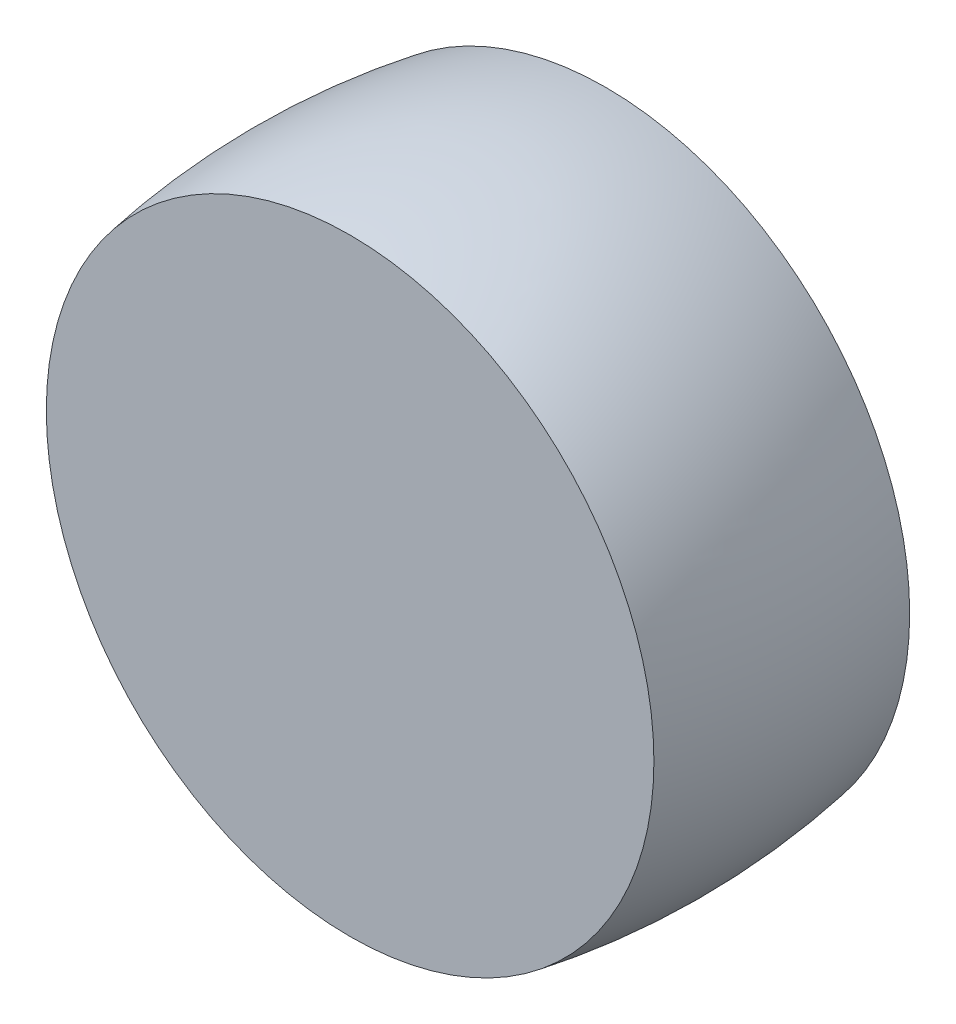
ISO-10303-21;
HEADER;
FILE_DESCRIPTION(('STEP AP214'),'2;1');
FILE_NAME('part.step','',(''),(''),'','','');
FILE_SCHEMA(('AUTOMOTIVE_DESIGN { 1 0 10303 214 1 1 1 1 }'));
ENDSEC;
DATA;
#1=APPLICATION_CONTEXT('core data for automotive mechanical design processes');
#2=APPLICATION_PROTOCOL_DEFINITION('international standard','automotive_design',2000,#1);
#3=PRODUCT_CONTEXT('',#1,'mechanical');
#4=PRODUCT('Part','Part','',(#3));
#5=PRODUCT_RELATED_PRODUCT_CATEGORY('part','',(#4));
#6=PRODUCT_DEFINITION_FORMATION('','',#4);
#7=PRODUCT_DEFINITION_CONTEXT('part definition',#1,'design');
#8=PRODUCT_DEFINITION('design','',#6,#7);
#9=PRODUCT_DEFINITION_SHAPE('','',#8);
#10=(LENGTH_UNIT() NAMED_UNIT(*) SI_UNIT(.MILLI.,.METRE.));
#11=(NAMED_UNIT(*) PLANE_ANGLE_UNIT() SI_UNIT($,.RADIAN.));
#12=(NAMED_UNIT(*) SI_UNIT($,.STERADIAN.) SOLID_ANGLE_UNIT());
#13=UNCERTAINTY_MEASURE_WITH_UNIT(LENGTH_MEASURE(1.E-05),#10,'distance_accuracy_value','');
#14=(GEOMETRIC_REPRESENTATION_CONTEXT(3) GLOBAL_UNCERTAINTY_ASSIGNED_CONTEXT((#13)) GLOBAL_UNIT_ASSIGNED_CONTEXT((#10,
#11,#12)) REPRESENTATION_CONTEXT('',''));
#15=CARTESIAN_POINT('',(0.,0.,0.));
#16=DIRECTION('',(0.,0.,1.));
#17=DIRECTION('',(1.,0.,0.));
#18=AXIS2_PLACEMENT_3D('',#15,#16,#17);
#19=CARTESIAN_POINT('',(0.,0.,0.));
#20=DIRECTION('',(0.,0.,1.));
#21=DIRECTION('',(1.,0.,0.));
#22=AXIS2_PLACEMENT_3D('',#19,#20,#21);
#23=PLANE('',#22);
#24=DIRECTION('',(-0.5,0.866025403784439,0.));
#25=VECTOR('',#24,1.);
#26=CARTESIAN_POINT('',(-3.46410161513775,-6.,0.));
#27=LINE('',#26,#25);
#28=CARTESIAN_POINT('',(-3.46410161513775,-6.,0.));
#29=VERTEX_POINT('',#28);
#30=CARTESIAN_POINT('',(-6.92820323027551,0.,0.));
#31=VERTEX_POINT('',#30);
#32=EDGE_CURVE('E135',#29,#31,#27,.T.);
#33=ORIENTED_EDGE('',*,*,#32,.F.);
#34=DIRECTION('',(-1.,0.,0.));
#35=VECTOR('',#34,1.);
#36=CARTESIAN_POINT('',(3.46410161513775,-6.,0.));
#37=LINE('',#36,#35);
#38=CARTESIAN_POINT('',(3.46410161513775,-6.,0.));
#39=VERTEX_POINT('',#38);
#40=EDGE_CURVE('E55',#39,#29,#37,.T.);
#41=ORIENTED_EDGE('',*,*,#40,.F.);
#42=DIRECTION('',(-0.5,-0.866025403784439,0.));
#43=VECTOR('',#42,1.);
#44=CARTESIAN_POINT('',(6.92820323027551,0.,0.));
#45=LINE('',#44,#43);
#46=CARTESIAN_POINT('',(6.92820323027551,0.,0.));
#47=VERTEX_POINT('',#46);
#48=EDGE_CURVE('E148',#47,#39,#45,.T.);
#49=ORIENTED_EDGE('',*,*,#48,.F.);
#50=DIRECTION('',(0.5,-0.866025403784439,0.));
#51=VECTOR('',#50,1.);
#52=CARTESIAN_POINT('',(3.46410161513776,6.,0.));
#53=LINE('',#52,#51);
#54=CARTESIAN_POINT('',(3.46410161513776,6.,0.));
#55=VERTEX_POINT('',#54);
#56=EDGE_CURVE('E145',#55,#47,#53,.T.);
#57=ORIENTED_EDGE('',*,*,#56,.F.);
#58=DIRECTION('',(1.,0.,0.));
#59=VECTOR('',#58,1.);
#60=CARTESIAN_POINT('',(-3.46410161513775,6.,0.));
#61=LINE('',#60,#59);
#62=CARTESIAN_POINT('',(-3.46410161513775,6.,0.));
#63=VERTEX_POINT('',#62);
#64=EDGE_CURVE('E103',#63,#55,#61,.T.);
#65=ORIENTED_EDGE('',*,*,#64,.F.);
#66=DIRECTION('',(0.5,0.866025403784438,0.));
#67=VECTOR('',#66,1.);
#68=CARTESIAN_POINT('',(-6.92820323027551,0.,0.));
#69=LINE('',#68,#67);
#70=EDGE_CURVE('E139',#31,#63,#69,.T.);
#71=ORIENTED_EDGE('',*,*,#70,.F.);
#72=EDGE_LOOP('',(#33,#41,#49,#57,#65,#71));
#73=FACE_BOUND('',#72,.T.);
#74=CARTESIAN_POINT('',(0.,0.,0.));
#75=DIRECTION('',(0.,0.,-1.));
#76=DIRECTION('',(-1.,0.,0.));
#77=AXIS2_PLACEMENT_3D('',#74,#75,#76);
#78=CIRCLE('',#77,30.882887531048);
#79=CARTESIAN_POINT('',(-30.882887531048,0.,0.));
#80=VERTEX_POINT('',#79);
#81=EDGE_CURVE('E48',#80,#80,#78,.T.);
#82=ORIENTED_EDGE('',*,*,#81,.T.);
#83=EDGE_LOOP('',(#82));
#84=FACE_BOUND('',#83,.T.);
#85=ADVANCED_FACE('F40',(#73,#84),#23,.F.);
#86=CARTESIAN_POINT('',(0.,0.,13.));
#87=DIRECTION('',(0.,0.,-1.));
#88=DIRECTION('',(-1.,0.,0.));
#89=AXIS2_PLACEMENT_3D('',#86,#87,#88);
#90=DEGENERATE_TOROIDAL_SURFACE('',#89,44.2,76.2,.F.);
#91=CARTESIAN_POINT('',(0.,0.,26.));
#92=DIRECTION('',(0.,0.,-1.));
#93=DIRECTION('',(-1.,0.,0.));
#94=AXIS2_PLACEMENT_3D('',#91,#92,#93);
#95=CIRCLE('',#94,30.882887531048);
#96=CARTESIAN_POINT('',(-30.882887531048,0.,26.));
#97=VERTEX_POINT('',#96);
#98=EDGE_CURVE('E11',#97,#97,#95,.T.);
#99=ORIENTED_EDGE('',*,*,#98,.T.);
#100=EDGE_LOOP('',(#99));
#101=FACE_BOUND('',#100,.T.);
#102=ORIENTED_EDGE('',*,*,#81,.F.);
#103=EDGE_LOOP('',(#102));
#104=FACE_BOUND('',#103,.T.);
#105=ADVANCED_FACE('F167',(#101,#104),#90,.F.);
#106=CARTESIAN_POINT('',(0.,0.,26.));
#107=DIRECTION('',(0.,0.,1.));
#108=DIRECTION('',(1.,0.,0.));
#109=AXIS2_PLACEMENT_3D('',#106,#107,#108);
#110=PLANE('',#109);
#111=ORIENTED_EDGE('',*,*,#98,.F.);
#112=EDGE_LOOP('',(#111));
#113=FACE_BOUND('',#112,.T.);
#114=ADVANCED_FACE('F169',(#113),#110,.T.);
#115=CARTESIAN_POINT('',(3.46410161513775,-6.,16.));
#116=DIRECTION('',(0.,-1.,0.));
#117=DIRECTION('',(1.,0.,0.));
#118=AXIS2_PLACEMENT_3D('',#115,#116,#117);
#119=PLANE('',#118);
#120=ORIENTED_EDGE('',*,*,#40,.T.);
#121=DIRECTION('',(0.,0.,-1.));
#122=VECTOR('',#121,1.);
#123=CARTESIAN_POINT('',(-3.46410161513775,-6.,16.));
#124=LINE('',#123,#122);
#125=CARTESIAN_POINT('',(-3.46410161513775,-6.,16.));
#126=VERTEX_POINT('',#125);
#127=EDGE_CURVE('E85',#126,#29,#124,.T.);
#128=ORIENTED_EDGE('',*,*,#127,.F.);
#129=DIRECTION('',(-1.,0.,0.));
#130=VECTOR('',#129,1.);
#131=CARTESIAN_POINT('',(3.46410161513775,-6.,16.));
#132=LINE('',#131,#130);
#133=CARTESIAN_POINT('',(3.46410161513775,-6.,16.));
#134=VERTEX_POINT('',#133);
#135=EDGE_CURVE('E151',#134,#126,#132,.T.);
#136=ORIENTED_EDGE('',*,*,#135,.F.);
#137=DIRECTION('',(0.,0.,-1.));
#138=VECTOR('',#137,1.);
#139=CARTESIAN_POINT('',(3.46410161513775,-6.,16.));
#140=LINE('',#139,#138);
#141=EDGE_CURVE('E63',#134,#39,#140,.T.);
#142=ORIENTED_EDGE('',*,*,#141,.T.);
#143=EDGE_LOOP('',(#120,#128,#136,#142));
#144=FACE_BOUND('',#143,.T.);
#145=ADVANCED_FACE('F176',(#144),#119,.F.);
#146=CARTESIAN_POINT('',(6.92820323027551,0.,16.));
#147=DIRECTION('',(0.866025403784439,-0.5,0.));
#148=DIRECTION('',(0.5,0.866025403784439,0.));
#149=AXIS2_PLACEMENT_3D('',#146,#147,#148);
#150=PLANE('',#149);
#151=ORIENTED_EDGE('',*,*,#48,.T.);
#152=ORIENTED_EDGE('',*,*,#141,.F.);
#153=DIRECTION('',(-0.5,-0.866025403784439,0.));
#154=VECTOR('',#153,1.);
#155=CARTESIAN_POINT('',(6.92820323027551,0.,16.));
#156=LINE('',#155,#154);
#157=CARTESIAN_POINT('',(6.92820323027551,0.,16.));
#158=VERTEX_POINT('',#157);
#159=EDGE_CURVE('E117',#158,#134,#156,.T.);
#160=ORIENTED_EDGE('',*,*,#159,.F.);
#161=DIRECTION('',(0.,0.,-1.));
#162=VECTOR('',#161,1.);
#163=CARTESIAN_POINT('',(6.92820323027551,0.,16.));
#164=LINE('',#163,#162);
#165=EDGE_CURVE('E108',#158,#47,#164,.T.);
#166=ORIENTED_EDGE('',*,*,#165,.T.);
#167=EDGE_LOOP('',(#151,#152,#160,#166));
#168=FACE_BOUND('',#167,.T.);
#169=ADVANCED_FACE('F183',(#168),#150,.F.);
#170=CARTESIAN_POINT('',(3.46410161513776,6.,16.));
#171=DIRECTION('',(0.866025403784439,0.5,0.));
#172=DIRECTION('',(-0.5,0.866025403784439,0.));
#173=AXIS2_PLACEMENT_3D('',#170,#171,#172);
#174=PLANE('',#173);
#175=ORIENTED_EDGE('',*,*,#56,.T.);
#176=ORIENTED_EDGE('',*,*,#165,.F.);
#177=DIRECTION('',(0.5,-0.866025403784439,0.));
#178=VECTOR('',#177,1.);
#179=CARTESIAN_POINT('',(3.46410161513776,6.,16.));
#180=LINE('',#179,#178);
#181=CARTESIAN_POINT('',(3.46410161513776,6.,16.));
#182=VERTEX_POINT('',#181);
#183=EDGE_CURVE('E112',#182,#158,#180,.T.);
#184=ORIENTED_EDGE('',*,*,#183,.F.);
#185=DIRECTION('',(0.,0.,-1.));
#186=VECTOR('',#185,1.);
#187=CARTESIAN_POINT('',(3.46410161513776,6.,16.));
#188=LINE('',#187,#186);
#189=EDGE_CURVE('E96',#182,#55,#188,.T.);
#190=ORIENTED_EDGE('',*,*,#189,.T.);
#191=EDGE_LOOP('',(#175,#176,#184,#190));
#192=FACE_BOUND('',#191,.T.);
#193=ADVANCED_FACE('F113',(#192),#174,.F.);
#194=CARTESIAN_POINT('',(-3.46410161513775,6.,16.));
#195=DIRECTION('',(0.,1.,0.));
#196=DIRECTION('',(0.,0.,1.));
#197=AXIS2_PLACEMENT_3D('',#194,#195,#196);
#198=PLANE('',#197);
#199=ORIENTED_EDGE('',*,*,#64,.T.);
#200=ORIENTED_EDGE('',*,*,#189,.F.);
#201=DIRECTION('',(1.,0.,0.));
#202=VECTOR('',#201,1.);
#203=CARTESIAN_POINT('',(-3.46410161513775,6.,16.));
#204=LINE('',#203,#202);
#205=CARTESIAN_POINT('',(-3.46410161513775,6.,16.));
#206=VERTEX_POINT('',#205);
#207=EDGE_CURVE('E100',#206,#182,#204,.T.);
#208=ORIENTED_EDGE('',*,*,#207,.F.);
#209=DIRECTION('',(0.,0.,-1.));
#210=VECTOR('',#209,1.);
#211=CARTESIAN_POINT('',(-3.46410161513775,6.,16.));
#212=LINE('',#211,#210);
#213=EDGE_CURVE('E109',#206,#63,#212,.T.);
#214=ORIENTED_EDGE('',*,*,#213,.T.);
#215=EDGE_LOOP('',(#199,#200,#208,#214));
#216=FACE_BOUND('',#215,.T.);
#217=ADVANCED_FACE('F98',(#216),#198,.F.);
#218=CARTESIAN_POINT('',(-6.92820323027551,0.,16.));
#219=DIRECTION('',(-0.866025403784439,0.5,0.));
#220=DIRECTION('',(-0.5,-0.866025403784438,0.));
#221=AXIS2_PLACEMENT_3D('',#218,#219,#220);
#222=PLANE('',#221);
#223=ORIENTED_EDGE('',*,*,#70,.T.);
#224=ORIENTED_EDGE('',*,*,#213,.F.);
#225=DIRECTION('',(0.5,0.866025403784438,0.));
#226=VECTOR('',#225,1.);
#227=CARTESIAN_POINT('',(-6.92820323027551,0.,16.));
#228=LINE('',#227,#226);
#229=CARTESIAN_POINT('',(-6.92820323027551,0.,16.));
#230=VERTEX_POINT('',#229);
#231=EDGE_CURVE('E123',#230,#206,#228,.T.);
#232=ORIENTED_EDGE('',*,*,#231,.F.);
#233=DIRECTION('',(0.,0.,-1.));
#234=VECTOR('',#233,1.);
#235=CARTESIAN_POINT('',(-6.92820323027551,0.,16.));
#236=LINE('',#235,#234);
#237=EDGE_CURVE('E158',#230,#31,#236,.T.);
#238=ORIENTED_EDGE('',*,*,#237,.T.);
#239=EDGE_LOOP('',(#223,#224,#232,#238));
#240=FACE_BOUND('',#239,.T.);
#241=ADVANCED_FACE('F187',(#240),#222,.F.);
#242=CARTESIAN_POINT('',(-3.46410161513775,-6.,16.));
#243=DIRECTION('',(-0.866025403784439,-0.5,0.));
#244=DIRECTION('',(0.5,-0.866025403784439,0.));
#245=AXIS2_PLACEMENT_3D('',#242,#243,#244);
#246=PLANE('',#245);
#247=ORIENTED_EDGE('',*,*,#32,.T.);
#248=ORIENTED_EDGE('',*,*,#237,.F.);
#249=DIRECTION('',(-0.5,0.866025403784439,0.));
#250=VECTOR('',#249,1.);
#251=CARTESIAN_POINT('',(-3.46410161513775,-6.,16.));
#252=LINE('',#251,#250);
#253=EDGE_CURVE('E127',#126,#230,#252,.T.);
#254=ORIENTED_EDGE('',*,*,#253,.F.);
#255=ORIENTED_EDGE('',*,*,#127,.T.);
#256=EDGE_LOOP('',(#247,#248,#254,#255));
#257=FACE_BOUND('',#256,.T.);
#258=ADVANCED_FACE('F184',(#257),#246,.F.);
#259=CARTESIAN_POINT('',(0.,0.,16.));
#260=DIRECTION('',(0.,0.,-1.));
#261=DIRECTION('',(-1.,0.,0.));
#262=AXIS2_PLACEMENT_3D('',#259,#260,#261);
#263=PLANE('',#262);
#264=ORIENTED_EDGE('',*,*,#135,.T.);
#265=ORIENTED_EDGE('',*,*,#253,.T.);
#266=ORIENTED_EDGE('',*,*,#231,.T.);
#267=ORIENTED_EDGE('',*,*,#207,.T.);
#268=ORIENTED_EDGE('',*,*,#183,.T.);
#269=ORIENTED_EDGE('',*,*,#159,.T.);
#270=EDGE_LOOP('',(#264,#265,#266,#267,#268,#269));
#271=FACE_BOUND('',#270,.T.);
#272=ADVANCED_FACE('F120',(#271),#263,.T.);
#273=CLOSED_SHELL('',(#85,#105,#114,#145,#169,#193,#217,#241,#258,#272));
#274=MANIFOLD_SOLID_BREP('B2',#273);
#275=ADVANCED_BREP_SHAPE_REPRESENTATION('',(#18,#274),#14);
#276=SHAPE_DEFINITION_REPRESENTATION(#9,#275);
ENDSEC;
END-ISO-10303-21;
